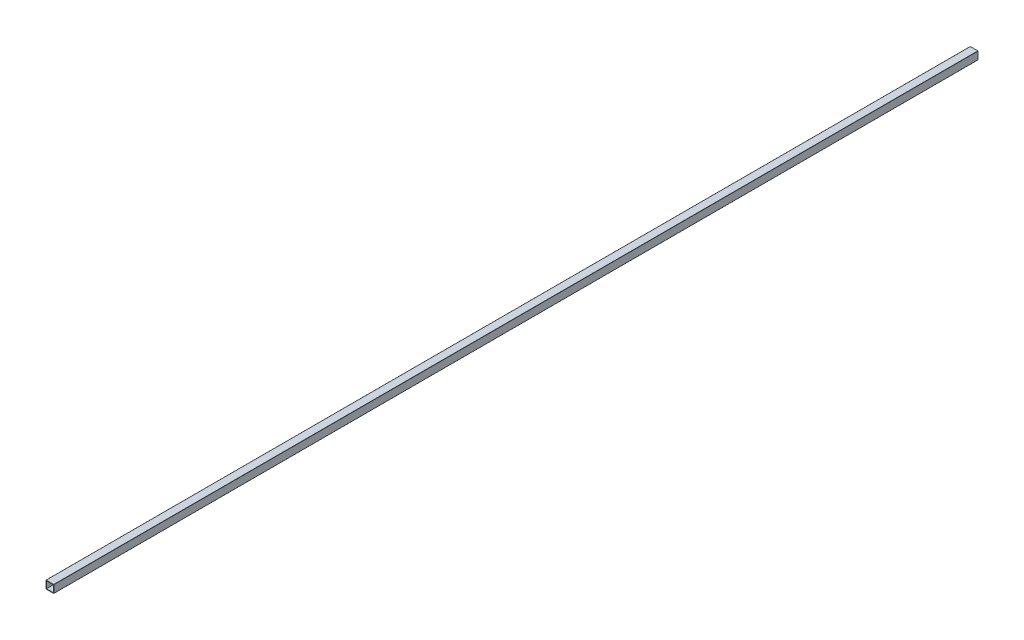
ISO-10303-21;
HEADER;
FILE_DESCRIPTION(('STEP AP214'),'2;1');
FILE_NAME('part.step','',(''),(''),'','','');
FILE_SCHEMA(('AUTOMOTIVE_DESIGN { 1 0 10303 214 1 1 1 1 }'));
ENDSEC;
DATA;
#1=APPLICATION_CONTEXT('core data for automotive mechanical design processes');
#2=APPLICATION_PROTOCOL_DEFINITION('international standard','automotive_design',2000,#1);
#3=PRODUCT_CONTEXT('',#1,'mechanical');
#4=PRODUCT('Part','Part','',(#3));
#5=PRODUCT_RELATED_PRODUCT_CATEGORY('part','',(#4));
#6=PRODUCT_DEFINITION_FORMATION('','',#4);
#7=PRODUCT_DEFINITION_CONTEXT('part definition',#1,'design');
#8=PRODUCT_DEFINITION('design','',#6,#7);
#9=PRODUCT_DEFINITION_SHAPE('','',#8);
#10=(LENGTH_UNIT() NAMED_UNIT(*) SI_UNIT(.MILLI.,.METRE.));
#11=(NAMED_UNIT(*) PLANE_ANGLE_UNIT() SI_UNIT($,.RADIAN.));
#12=(NAMED_UNIT(*) SI_UNIT($,.STERADIAN.) SOLID_ANGLE_UNIT());
#13=UNCERTAINTY_MEASURE_WITH_UNIT(LENGTH_MEASURE(1.E-05),#10,'distance_accuracy_value','');
#14=(GEOMETRIC_REPRESENTATION_CONTEXT(3) GLOBAL_UNCERTAINTY_ASSIGNED_CONTEXT((#13)) GLOBAL_UNIT_ASSIGNED_CONTEXT((#10,
#11,#12)) REPRESENTATION_CONTEXT('',''));
#15=CARTESIAN_POINT('',(0.,0.,0.));
#16=DIRECTION('',(0.,0.,1.));
#17=DIRECTION('',(1.,0.,0.));
#18=AXIS2_PLACEMENT_3D('',#15,#16,#17);
#19=CARTESIAN_POINT('',(24.4,24.4,6000.));
#20=DIRECTION('',(0.,0.,-1.));
#21=DIRECTION('',(-1.,0.,0.));
#22=AXIS2_PLACEMENT_3D('',#19,#20,#21);
#23=PLANE('',#22);
#24=CARTESIAN_POINT('',(24.4,24.4,6000.));
#25=DIRECTION('',(0.,0.,1.));
#26=DIRECTION('',(-1.,0.,0.));
#27=AXIS2_PLACEMENT_3D('',#24,#25,#26);
#28=CIRCLE('',#27,1.);
#29=CARTESIAN_POINT('',(25.4,24.4,6000.));
#30=VERTEX_POINT('',#29);
#31=CARTESIAN_POINT('',(24.4,25.4,6000.));
#32=VERTEX_POINT('',#31);
#33=EDGE_CURVE('E158',#30,#32,#28,.T.);
#34=ORIENTED_EDGE('',*,*,#33,.T.);
#35=DIRECTION('',(-1.,0.,0.));
#36=VECTOR('',#35,1.);
#37=CARTESIAN_POINT('',(-24.4,25.4,6000.));
#38=LINE('',#37,#36);
#39=CARTESIAN_POINT('',(-24.4,25.4,6000.));
#40=VERTEX_POINT('',#39);
#41=EDGE_CURVE('E161',#32,#40,#38,.T.);
#42=ORIENTED_EDGE('',*,*,#41,.T.);
#43=CARTESIAN_POINT('',(-24.4,24.4,6000.));
#44=DIRECTION('',(0.,0.,1.));
#45=DIRECTION('',(-1.,0.,0.));
#46=AXIS2_PLACEMENT_3D('',#43,#44,#45);
#47=CIRCLE('',#46,1.);
#48=CARTESIAN_POINT('',(-25.4,24.4,6000.));
#49=VERTEX_POINT('',#48);
#50=EDGE_CURVE('E164',#40,#49,#47,.T.);
#51=ORIENTED_EDGE('',*,*,#50,.T.);
#52=DIRECTION('',(0.,-1.,0.));
#53=VECTOR('',#52,1.);
#54=CARTESIAN_POINT('',(-25.4,-24.4,6000.));
#55=LINE('',#54,#53);
#56=CARTESIAN_POINT('',(-25.4,-24.4,6000.));
#57=VERTEX_POINT('',#56);
#58=EDGE_CURVE('E166',#49,#57,#55,.T.);
#59=ORIENTED_EDGE('',*,*,#58,.T.);
#60=CARTESIAN_POINT('',(-24.4,-24.4,6000.));
#61=DIRECTION('',(0.,0.,1.));
#62=DIRECTION('',(-1.,0.,0.));
#63=AXIS2_PLACEMENT_3D('',#60,#61,#62);
#64=CIRCLE('',#63,1.);
#65=CARTESIAN_POINT('',(-24.4,-25.4,6000.));
#66=VERTEX_POINT('',#65);
#67=EDGE_CURVE('E168',#57,#66,#64,.T.);
#68=ORIENTED_EDGE('',*,*,#67,.T.);
#69=DIRECTION('',(1.,0.,0.));
#70=VECTOR('',#69,1.);
#71=CARTESIAN_POINT('',(-24.4,-25.4,6000.));
#72=LINE('',#71,#70);
#73=CARTESIAN_POINT('',(24.4,-25.4,6000.));
#74=VERTEX_POINT('',#73);
#75=EDGE_CURVE('E170',#66,#74,#72,.T.);
#76=ORIENTED_EDGE('',*,*,#75,.T.);
#77=CARTESIAN_POINT('',(24.4,-24.4,6000.));
#78=DIRECTION('',(0.,0.,1.));
#79=DIRECTION('',(1.,0.,0.));
#80=AXIS2_PLACEMENT_3D('',#77,#78,#79);
#81=CIRCLE('',#80,1.);
#82=CARTESIAN_POINT('',(25.4,-24.4,6000.));
#83=VERTEX_POINT('',#82);
#84=EDGE_CURVE('E172',#74,#83,#81,.T.);
#85=ORIENTED_EDGE('',*,*,#84,.T.);
#86=DIRECTION('',(0.,1.,0.));
#87=VECTOR('',#86,1.);
#88=CARTESIAN_POINT('',(25.4,-24.4,6000.));
#89=LINE('',#88,#87);
#90=EDGE_CURVE('E174',#83,#30,#89,.T.);
#91=ORIENTED_EDGE('',*,*,#90,.T.);
#92=EDGE_LOOP('',(#34,#42,#51,#59,#68,#76,#85,#91));
#93=FACE_BOUND('',#92,.T.);
#94=DIRECTION('',(1.,0.,0.));
#95=VECTOR('',#94,1.);
#96=CARTESIAN_POINT('',(-22.36,-22.36,6000.));
#97=LINE('',#96,#95);
#98=CARTESIAN_POINT('',(-22.36,-22.36,6000.));
#99=VERTEX_POINT('',#98);
#100=CARTESIAN_POINT('',(22.36,-22.36,6000.));
#101=VERTEX_POINT('',#100);
#102=EDGE_CURVE('E122',#99,#101,#97,.T.);
#103=ORIENTED_EDGE('',*,*,#102,.F.);
#104=DIRECTION('',(0.,-1.,0.));
#105=VECTOR('',#104,1.);
#106=CARTESIAN_POINT('',(-22.36,-22.36,6000.));
#107=LINE('',#106,#105);
#108=CARTESIAN_POINT('',(-22.36,22.36,6000.));
#109=VERTEX_POINT('',#108);
#110=EDGE_CURVE('E144',#109,#99,#107,.T.);
#111=ORIENTED_EDGE('',*,*,#110,.F.);
#112=DIRECTION('',(-1.,0.,0.));
#113=VECTOR('',#112,1.);
#114=CARTESIAN_POINT('',(-22.36,22.36,6000.));
#115=LINE('',#114,#113);
#116=CARTESIAN_POINT('',(22.36,22.36,6000.));
#117=VERTEX_POINT('',#116);
#118=EDGE_CURVE('E142',#117,#109,#115,.T.);
#119=ORIENTED_EDGE('',*,*,#118,.F.);
#120=DIRECTION('',(0.,1.,0.));
#121=VECTOR('',#120,1.);
#122=CARTESIAN_POINT('',(22.36,-22.36,6000.));
#123=LINE('',#122,#121);
#124=EDGE_CURVE('E130',#101,#117,#123,.T.);
#125=ORIENTED_EDGE('',*,*,#124,.F.);
#126=EDGE_LOOP('',(#103,#111,#119,#125));
#127=FACE_BOUND('',#126,.T.);
#128=ADVANCED_FACE('F33',(#93,#127),#23,.F.);
#129=CARTESIAN_POINT('',(24.4,24.4,0.));
#130=DIRECTION('',(0.,0.,-1.));
#131=DIRECTION('',(-1.,0.,0.));
#132=AXIS2_PLACEMENT_3D('',#129,#130,#131);
#133=PLANE('',#132);
#134=CARTESIAN_POINT('',(24.4,24.4,0.));
#135=DIRECTION('',(0.,0.,1.));
#136=DIRECTION('',(-1.,0.,0.));
#137=AXIS2_PLACEMENT_3D('',#134,#135,#136);
#138=CIRCLE('',#137,1.);
#139=CARTESIAN_POINT('',(25.4,24.4,0.));
#140=VERTEX_POINT('',#139);
#141=CARTESIAN_POINT('',(24.4,25.4,0.));
#142=VERTEX_POINT('',#141);
#143=EDGE_CURVE('E138',#140,#142,#138,.T.);
#144=ORIENTED_EDGE('',*,*,#143,.F.);
#145=DIRECTION('',(0.,1.,0.));
#146=VECTOR('',#145,1.);
#147=CARTESIAN_POINT('',(25.4,-24.4,0.));
#148=LINE('',#147,#146);
#149=CARTESIAN_POINT('',(25.4,-24.4,0.));
#150=VERTEX_POINT('',#149);
#151=EDGE_CURVE('E162',#150,#140,#148,.T.);
#152=ORIENTED_EDGE('',*,*,#151,.F.);
#153=CARTESIAN_POINT('',(24.4,-24.4,0.));
#154=DIRECTION('',(0.,0.,1.));
#155=DIRECTION('',(1.,0.,0.));
#156=AXIS2_PLACEMENT_3D('',#153,#154,#155);
#157=CIRCLE('',#156,1.);
#158=CARTESIAN_POINT('',(24.4,-25.4,0.));
#159=VERTEX_POINT('',#158);
#160=EDGE_CURVE('E189',#159,#150,#157,.T.);
#161=ORIENTED_EDGE('',*,*,#160,.F.);
#162=DIRECTION('',(1.,0.,0.));
#163=VECTOR('',#162,1.);
#164=CARTESIAN_POINT('',(-24.4,-25.4,0.));
#165=LINE('',#164,#163);
#166=CARTESIAN_POINT('',(-24.4,-25.4,0.));
#167=VERTEX_POINT('',#166);
#168=EDGE_CURVE('E187',#167,#159,#165,.T.);
#169=ORIENTED_EDGE('',*,*,#168,.F.);
#170=CARTESIAN_POINT('',(-24.4,-24.4,0.));
#171=DIRECTION('',(0.,0.,1.));
#172=DIRECTION('',(-1.,0.,0.));
#173=AXIS2_PLACEMENT_3D('',#170,#171,#172);
#174=CIRCLE('',#173,1.);
#175=CARTESIAN_POINT('',(-25.4,-24.4,0.));
#176=VERTEX_POINT('',#175);
#177=EDGE_CURVE('E185',#176,#167,#174,.T.);
#178=ORIENTED_EDGE('',*,*,#177,.F.);
#179=DIRECTION('',(0.,-1.,0.));
#180=VECTOR('',#179,1.);
#181=CARTESIAN_POINT('',(-25.4,-24.4,0.));
#182=LINE('',#181,#180);
#183=CARTESIAN_POINT('',(-25.4,24.4,0.));
#184=VERTEX_POINT('',#183);
#185=EDGE_CURVE('E183',#184,#176,#182,.T.);
#186=ORIENTED_EDGE('',*,*,#185,.F.);
#187=CARTESIAN_POINT('',(-24.4,24.4,0.));
#188=DIRECTION('',(0.,0.,1.));
#189=DIRECTION('',(-1.,0.,0.));
#190=AXIS2_PLACEMENT_3D('',#187,#188,#189);
#191=CIRCLE('',#190,1.);
#192=CARTESIAN_POINT('',(-24.4,25.4,0.));
#193=VERTEX_POINT('',#192);
#194=EDGE_CURVE('E181',#193,#184,#191,.T.);
#195=ORIENTED_EDGE('',*,*,#194,.F.);
#196=DIRECTION('',(-1.,0.,0.));
#197=VECTOR('',#196,1.);
#198=CARTESIAN_POINT('',(-24.4,25.4,0.));
#199=LINE('',#198,#197);
#200=EDGE_CURVE('E179',#142,#193,#199,.T.);
#201=ORIENTED_EDGE('',*,*,#200,.F.);
#202=EDGE_LOOP('',(#144,#152,#161,#169,#178,#186,#195,#201));
#203=FACE_BOUND('',#202,.T.);
#204=DIRECTION('',(0.,-1.,0.));
#205=VECTOR('',#204,1.);
#206=CARTESIAN_POINT('',(-22.36,-22.36,0.));
#207=LINE('',#206,#205);
#208=CARTESIAN_POINT('',(-22.36,22.36,0.));
#209=VERTEX_POINT('',#208);
#210=CARTESIAN_POINT('',(-22.36,-22.36,0.));
#211=VERTEX_POINT('',#210);
#212=EDGE_CURVE('E131',#209,#211,#207,.T.);
#213=ORIENTED_EDGE('',*,*,#212,.T.);
#214=DIRECTION('',(1.,0.,0.));
#215=VECTOR('',#214,1.);
#216=CARTESIAN_POINT('',(-22.36,-22.36,0.));
#217=LINE('',#216,#215);
#218=CARTESIAN_POINT('',(22.36,-22.36,0.));
#219=VERTEX_POINT('',#218);
#220=EDGE_CURVE('E56',#211,#219,#217,.T.);
#221=ORIENTED_EDGE('',*,*,#220,.T.);
#222=DIRECTION('',(0.,1.,0.));
#223=VECTOR('',#222,1.);
#224=CARTESIAN_POINT('',(22.36,-22.36,0.));
#225=LINE('',#224,#223);
#226=CARTESIAN_POINT('',(22.36,22.36,0.));
#227=VERTEX_POINT('',#226);
#228=EDGE_CURVE('E137',#219,#227,#225,.T.);
#229=ORIENTED_EDGE('',*,*,#228,.T.);
#230=DIRECTION('',(-1.,0.,0.));
#231=VECTOR('',#230,1.);
#232=CARTESIAN_POINT('',(-22.36,22.36,0.));
#233=LINE('',#232,#231);
#234=EDGE_CURVE('E150',#227,#209,#233,.T.);
#235=ORIENTED_EDGE('',*,*,#234,.T.);
#236=EDGE_LOOP('',(#213,#221,#229,#235));
#237=FACE_BOUND('',#236,.T.);
#238=ADVANCED_FACE('F219',(#203,#237),#133,.T.);
#239=CARTESIAN_POINT('',(24.4,24.4,6000.));
#240=DIRECTION('',(0.,0.,-1.));
#241=DIRECTION('',(-1.,0.,0.));
#242=AXIS2_PLACEMENT_3D('',#239,#240,#241);
#243=CYLINDRICAL_SURFACE('',#242,1.);
#244=ORIENTED_EDGE('',*,*,#143,.T.);
#245=DIRECTION('',(0.,0.,-1.));
#246=VECTOR('',#245,1.);
#247=CARTESIAN_POINT('',(24.4,25.4,6000.));
#248=LINE('',#247,#246);
#249=EDGE_CURVE('E11',#32,#142,#248,.T.);
#250=ORIENTED_EDGE('',*,*,#249,.F.);
#251=ORIENTED_EDGE('',*,*,#33,.F.);
#252=DIRECTION('',(0.,0.,-1.));
#253=VECTOR('',#252,1.);
#254=CARTESIAN_POINT('',(25.4,24.4,6000.));
#255=LINE('',#254,#253);
#256=EDGE_CURVE('E176',#30,#140,#255,.T.);
#257=ORIENTED_EDGE('',*,*,#256,.T.);
#258=EDGE_LOOP('',(#244,#250,#251,#257));
#259=FACE_BOUND('',#258,.T.);
#260=ADVANCED_FACE('F35',(#259),#243,.T.);
#261=CARTESIAN_POINT('',(-24.4,25.4,6000.));
#262=DIRECTION('',(0.,-1.,0.));
#263=DIRECTION('',(0.,0.,-1.));
#264=AXIS2_PLACEMENT_3D('',#261,#262,#263);
#265=PLANE('',#264);
#266=ORIENTED_EDGE('',*,*,#200,.T.);
#267=DIRECTION('',(0.,0.,-1.));
#268=VECTOR('',#267,1.);
#269=CARTESIAN_POINT('',(-24.4,25.4,6000.));
#270=LINE('',#269,#268);
#271=EDGE_CURVE('E41',#40,#193,#270,.T.);
#272=ORIENTED_EDGE('',*,*,#271,.F.);
#273=ORIENTED_EDGE('',*,*,#41,.F.);
#274=ORIENTED_EDGE('',*,*,#249,.T.);
#275=EDGE_LOOP('',(#266,#272,#273,#274));
#276=FACE_BOUND('',#275,.T.);
#277=ADVANCED_FACE('F236',(#276),#265,.F.);
#278=CARTESIAN_POINT('',(-24.4,24.4,6000.));
#279=DIRECTION('',(0.,0.,-1.));
#280=DIRECTION('',(-1.,0.,0.));
#281=AXIS2_PLACEMENT_3D('',#278,#279,#280);
#282=CYLINDRICAL_SURFACE('',#281,1.);
#283=ORIENTED_EDGE('',*,*,#194,.T.);
#284=DIRECTION('',(0.,0.,-1.));
#285=VECTOR('',#284,1.);
#286=CARTESIAN_POINT('',(-25.4,24.4,6000.));
#287=LINE('',#286,#285);
#288=EDGE_CURVE('E206',#49,#184,#287,.T.);
#289=ORIENTED_EDGE('',*,*,#288,.F.);
#290=ORIENTED_EDGE('',*,*,#50,.F.);
#291=ORIENTED_EDGE('',*,*,#271,.T.);
#292=EDGE_LOOP('',(#283,#289,#290,#291));
#293=FACE_BOUND('',#292,.T.);
#294=ADVANCED_FACE('F213',(#293),#282,.T.);
#295=CARTESIAN_POINT('',(-25.4,-24.4,6000.));
#296=DIRECTION('',(1.,0.,0.));
#297=DIRECTION('',(0.,0.,-1.));
#298=AXIS2_PLACEMENT_3D('',#295,#296,#297);
#299=PLANE('',#298);
#300=ORIENTED_EDGE('',*,*,#185,.T.);
#301=DIRECTION('',(0.,0.,-1.));
#302=VECTOR('',#301,1.);
#303=CARTESIAN_POINT('',(-25.4,-24.4,6000.));
#304=LINE('',#303,#302);
#305=EDGE_CURVE('E203',#57,#176,#304,.T.);
#306=ORIENTED_EDGE('',*,*,#305,.F.);
#307=ORIENTED_EDGE('',*,*,#58,.F.);
#308=ORIENTED_EDGE('',*,*,#288,.T.);
#309=EDGE_LOOP('',(#300,#306,#307,#308));
#310=FACE_BOUND('',#309,.T.);
#311=ADVANCED_FACE('F225',(#310),#299,.F.);
#312=CARTESIAN_POINT('',(-24.4,-24.4,6000.));
#313=DIRECTION('',(0.,0.,-1.));
#314=DIRECTION('',(-1.,0.,0.));
#315=AXIS2_PLACEMENT_3D('',#312,#313,#314);
#316=CYLINDRICAL_SURFACE('',#315,1.);
#317=ORIENTED_EDGE('',*,*,#177,.T.);
#318=DIRECTION('',(0.,0.,-1.));
#319=VECTOR('',#318,1.);
#320=CARTESIAN_POINT('',(-24.4,-25.4,6000.));
#321=LINE('',#320,#319);
#322=EDGE_CURVE('E200',#66,#167,#321,.T.);
#323=ORIENTED_EDGE('',*,*,#322,.F.);
#324=ORIENTED_EDGE('',*,*,#67,.F.);
#325=ORIENTED_EDGE('',*,*,#305,.T.);
#326=EDGE_LOOP('',(#317,#323,#324,#325));
#327=FACE_BOUND('',#326,.T.);
#328=ADVANCED_FACE('F229',(#327),#316,.T.);
#329=CARTESIAN_POINT('',(-24.4,-25.4,6000.));
#330=DIRECTION('',(0.,1.,0.));
#331=DIRECTION('',(0.,0.,1.));
#332=AXIS2_PLACEMENT_3D('',#329,#330,#331);
#333=PLANE('',#332);
#334=ORIENTED_EDGE('',*,*,#168,.T.);
#335=DIRECTION('',(0.,0.,-1.));
#336=VECTOR('',#335,1.);
#337=CARTESIAN_POINT('',(24.4,-25.4,6000.));
#338=LINE('',#337,#336);
#339=EDGE_CURVE('E197',#74,#159,#338,.T.);
#340=ORIENTED_EDGE('',*,*,#339,.F.);
#341=ORIENTED_EDGE('',*,*,#75,.F.);
#342=ORIENTED_EDGE('',*,*,#322,.T.);
#343=EDGE_LOOP('',(#334,#340,#341,#342));
#344=FACE_BOUND('',#343,.T.);
#345=ADVANCED_FACE('F249',(#344),#333,.F.);
#346=CARTESIAN_POINT('',(24.4,-24.4,6000.));
#347=DIRECTION('',(0.,0.,-1.));
#348=DIRECTION('',(-1.,0.,0.));
#349=AXIS2_PLACEMENT_3D('',#346,#347,#348);
#350=CYLINDRICAL_SURFACE('',#349,1.);
#351=ORIENTED_EDGE('',*,*,#160,.T.);
#352=DIRECTION('',(0.,0.,-1.));
#353=VECTOR('',#352,1.);
#354=CARTESIAN_POINT('',(25.4,-24.4,6000.));
#355=LINE('',#354,#353);
#356=EDGE_CURVE('E194',#83,#150,#355,.T.);
#357=ORIENTED_EDGE('',*,*,#356,.F.);
#358=ORIENTED_EDGE('',*,*,#84,.F.);
#359=ORIENTED_EDGE('',*,*,#339,.T.);
#360=EDGE_LOOP('',(#351,#357,#358,#359));
#361=FACE_BOUND('',#360,.T.);
#362=ADVANCED_FACE('F247',(#361),#350,.T.);
#363=CARTESIAN_POINT('',(25.4,-24.4,6000.));
#364=DIRECTION('',(-1.,0.,0.));
#365=DIRECTION('',(0.,0.,1.));
#366=AXIS2_PLACEMENT_3D('',#363,#364,#365);
#367=PLANE('',#366);
#368=ORIENTED_EDGE('',*,*,#151,.T.);
#369=ORIENTED_EDGE('',*,*,#256,.F.);
#370=ORIENTED_EDGE('',*,*,#90,.F.);
#371=ORIENTED_EDGE('',*,*,#356,.T.);
#372=EDGE_LOOP('',(#368,#369,#370,#371));
#373=FACE_BOUND('',#372,.T.);
#374=ADVANCED_FACE('F242',(#373),#367,.F.);
#375=CARTESIAN_POINT('',(-22.36,-22.36,6000.));
#376=DIRECTION('',(0.,1.,0.));
#377=DIRECTION('',(0.,0.,1.));
#378=AXIS2_PLACEMENT_3D('',#375,#376,#377);
#379=PLANE('',#378);
#380=ORIENTED_EDGE('',*,*,#220,.F.);
#381=DIRECTION('',(0.,0.,-1.));
#382=VECTOR('',#381,1.);
#383=CARTESIAN_POINT('',(-22.36,-22.36,6000.));
#384=LINE('',#383,#382);
#385=EDGE_CURVE('E126',#99,#211,#384,.T.);
#386=ORIENTED_EDGE('',*,*,#385,.F.);
#387=ORIENTED_EDGE('',*,*,#102,.T.);
#388=DIRECTION('',(0.,0.,-1.));
#389=VECTOR('',#388,1.);
#390=CARTESIAN_POINT('',(22.36,-22.36,6000.));
#391=LINE('',#390,#389);
#392=EDGE_CURVE('E125',#101,#219,#391,.T.);
#393=ORIENTED_EDGE('',*,*,#392,.T.);
#394=EDGE_LOOP('',(#380,#386,#387,#393));
#395=FACE_BOUND('',#394,.T.);
#396=ADVANCED_FACE('F124',(#395),#379,.T.);
#397=CARTESIAN_POINT('',(22.36,-22.36,6000.));
#398=DIRECTION('',(-1.,0.,0.));
#399=DIRECTION('',(0.,-1.,0.));
#400=AXIS2_PLACEMENT_3D('',#397,#398,#399);
#401=PLANE('',#400);
#402=ORIENTED_EDGE('',*,*,#228,.F.);
#403=ORIENTED_EDGE('',*,*,#392,.F.);
#404=ORIENTED_EDGE('',*,*,#124,.T.);
#405=DIRECTION('',(0.,0.,-1.));
#406=VECTOR('',#405,1.);
#407=CARTESIAN_POINT('',(22.36,22.36,6000.));
#408=LINE('',#407,#406);
#409=EDGE_CURVE('E139',#117,#227,#408,.T.);
#410=ORIENTED_EDGE('',*,*,#409,.T.);
#411=EDGE_LOOP('',(#402,#403,#404,#410));
#412=FACE_BOUND('',#411,.T.);
#413=ADVANCED_FACE('F134',(#412),#401,.T.);
#414=CARTESIAN_POINT('',(-22.36,22.36,6000.));
#415=DIRECTION('',(0.,-1.,0.));
#416=DIRECTION('',(1.,0.,0.));
#417=AXIS2_PLACEMENT_3D('',#414,#415,#416);
#418=PLANE('',#417);
#419=ORIENTED_EDGE('',*,*,#234,.F.);
#420=ORIENTED_EDGE('',*,*,#409,.F.);
#421=ORIENTED_EDGE('',*,*,#118,.T.);
#422=DIRECTION('',(0.,0.,-1.));
#423=VECTOR('',#422,1.);
#424=CARTESIAN_POINT('',(-22.36,22.36,6000.));
#425=LINE('',#424,#423);
#426=EDGE_CURVE('E48',#109,#209,#425,.T.);
#427=ORIENTED_EDGE('',*,*,#426,.T.);
#428=EDGE_LOOP('',(#419,#420,#421,#427));
#429=FACE_BOUND('',#428,.T.);
#430=ADVANCED_FACE('F274',(#429),#418,.T.);
#431=CARTESIAN_POINT('',(-22.36,-22.36,6000.));
#432=DIRECTION('',(1.,0.,0.));
#433=DIRECTION('',(0.,0.,-1.));
#434=AXIS2_PLACEMENT_3D('',#431,#432,#433);
#435=PLANE('',#434);
#436=ORIENTED_EDGE('',*,*,#212,.F.);
#437=ORIENTED_EDGE('',*,*,#426,.F.);
#438=ORIENTED_EDGE('',*,*,#110,.T.);
#439=ORIENTED_EDGE('',*,*,#385,.T.);
#440=EDGE_LOOP('',(#436,#437,#438,#439));
#441=FACE_BOUND('',#440,.T.);
#442=ADVANCED_FACE('F278',(#441),#435,.T.);
#443=CLOSED_SHELL('',(#128,#238,#260,#277,#294,#311,#328,#345,#362,#374,#396,#413,#430,#442));
#444=MANIFOLD_SOLID_BREP('B2',#443);
#445=ADVANCED_BREP_SHAPE_REPRESENTATION('',(#18,#444),#14);
#446=SHAPE_DEFINITION_REPRESENTATION(#9,#445);
ENDSEC;
END-ISO-10303-21;
